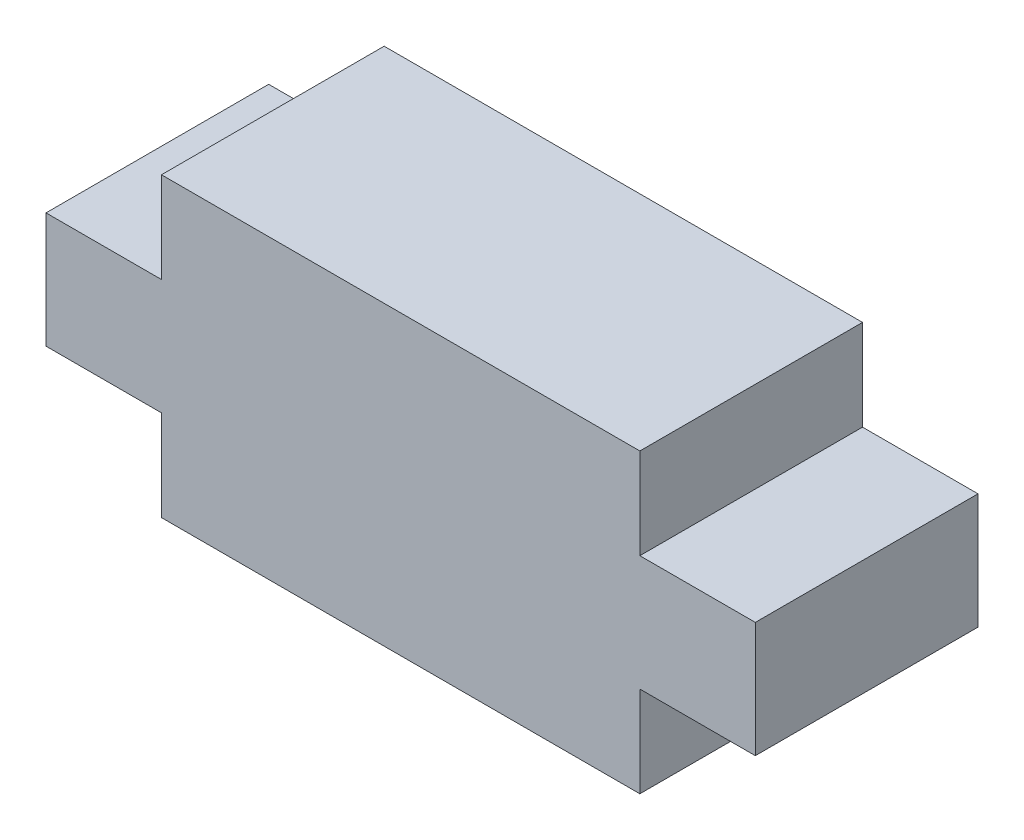
ISO-10303-21;
HEADER;
FILE_DESCRIPTION(('STEP AP214'),'2;1');
FILE_NAME('part.step','',(''),(''),'','','');
FILE_SCHEMA(('AUTOMOTIVE_DESIGN { 1 0 10303 214 1 1 1 1 }'));
ENDSEC;
DATA;
#1=APPLICATION_CONTEXT('core data for automotive mechanical design processes');
#2=APPLICATION_PROTOCOL_DEFINITION('international standard','automotive_design',2000,#1);
#3=PRODUCT_CONTEXT('',#1,'mechanical');
#4=PRODUCT('Part','Part','',(#3));
#5=PRODUCT_RELATED_PRODUCT_CATEGORY('part','',(#4));
#6=PRODUCT_DEFINITION_FORMATION('','',#4);
#7=PRODUCT_DEFINITION_CONTEXT('part definition',#1,'design');
#8=PRODUCT_DEFINITION('design','',#6,#7);
#9=PRODUCT_DEFINITION_SHAPE('','',#8);
#10=(LENGTH_UNIT() NAMED_UNIT(*) SI_UNIT(.MILLI.,.METRE.));
#11=(NAMED_UNIT(*) PLANE_ANGLE_UNIT() SI_UNIT($,.RADIAN.));
#12=(NAMED_UNIT(*) SI_UNIT($,.STERADIAN.) SOLID_ANGLE_UNIT());
#13=UNCERTAINTY_MEASURE_WITH_UNIT(LENGTH_MEASURE(1.E-05),#10,'distance_accuracy_value','');
#14=(GEOMETRIC_REPRESENTATION_CONTEXT(3) GLOBAL_UNCERTAINTY_ASSIGNED_CONTEXT((#13)) GLOBAL_UNIT_ASSIGNED_CONTEXT((#10,
#11,#12)) REPRESENTATION_CONTEXT('',''));
#15=CARTESIAN_POINT('',(0.,0.,0.));
#16=DIRECTION('',(0.,0.,1.));
#17=DIRECTION('',(1.,0.,0.));
#18=AXIS2_PLACEMENT_3D('',#15,#16,#17);
#19=CARTESIAN_POINT('',(2.15,-0.35,1.35));
#20=DIRECTION('',(-1.,0.,0.));
#21=DIRECTION('',(0.,0.,1.));
#22=AXIS2_PLACEMENT_3D('',#19,#20,#21);
#23=PLANE('',#22);
#24=DIRECTION('',(0.,1.,0.));
#25=VECTOR('',#24,1.);
#26=CARTESIAN_POINT('',(2.15,-0.35,0.));
#27=LINE('',#26,#25);
#28=CARTESIAN_POINT('',(2.15,-0.35,0.));
#29=VERTEX_POINT('',#28);
#30=CARTESIAN_POINT('',(2.15,0.35,0.));
#31=VERTEX_POINT('',#30);
#32=EDGE_CURVE('E154',#29,#31,#27,.T.);
#33=ORIENTED_EDGE('',*,*,#32,.T.);
#34=DIRECTION('',(0.,0.,-1.));
#35=VECTOR('',#34,1.);
#36=CARTESIAN_POINT('',(2.15,0.35,1.35));
#37=LINE('',#36,#35);
#38=CARTESIAN_POINT('',(2.15,0.35,1.35));
#39=VERTEX_POINT('',#38);
#40=EDGE_CURVE('E11',#39,#31,#37,.T.);
#41=ORIENTED_EDGE('',*,*,#40,.F.);
#42=DIRECTION('',(0.,1.,0.));
#43=VECTOR('',#42,1.);
#44=CARTESIAN_POINT('',(2.15,-0.35,1.35));
#45=LINE('',#44,#43);
#46=CARTESIAN_POINT('',(2.15,-0.35,1.35));
#47=VERTEX_POINT('',#46);
#48=EDGE_CURVE('E176',#47,#39,#45,.T.);
#49=ORIENTED_EDGE('',*,*,#48,.F.);
#50=DIRECTION('',(0.,0.,-1.));
#51=VECTOR('',#50,1.);
#52=CARTESIAN_POINT('',(2.15,-0.35,1.35));
#53=LINE('',#52,#51);
#54=EDGE_CURVE('E150',#47,#29,#53,.T.);
#55=ORIENTED_EDGE('',*,*,#54,.T.);
#56=EDGE_LOOP('',(#33,#41,#49,#55));
#57=FACE_BOUND('',#56,.T.);
#58=ADVANCED_FACE('F34',(#57),#23,.F.);
#59=CARTESIAN_POINT('',(2.15,0.35,1.35));
#60=DIRECTION('',(0.,-1.,0.));
#61=DIRECTION('',(0.,0.,-1.));
#62=AXIS2_PLACEMENT_3D('',#59,#60,#61);
#63=PLANE('',#62);
#64=DIRECTION('',(-1.,0.,0.));
#65=VECTOR('',#64,1.);
#66=CARTESIAN_POINT('',(2.15,0.35,0.));
#67=LINE('',#66,#65);
#68=CARTESIAN_POINT('',(1.45,0.35,0.));
#69=VERTEX_POINT('',#68);
#70=EDGE_CURVE('E157',#31,#69,#67,.T.);
#71=ORIENTED_EDGE('',*,*,#70,.T.);
#72=DIRECTION('',(0.,0.,-1.));
#73=VECTOR('',#72,1.);
#74=CARTESIAN_POINT('',(1.45,0.35,1.35));
#75=LINE('',#74,#73);
#76=CARTESIAN_POINT('',(1.45,0.35,1.35));
#77=VERTEX_POINT('',#76);
#78=EDGE_CURVE('E42',#77,#69,#75,.T.);
#79=ORIENTED_EDGE('',*,*,#78,.F.);
#80=DIRECTION('',(-1.,0.,0.));
#81=VECTOR('',#80,1.);
#82=CARTESIAN_POINT('',(2.15,0.35,1.35));
#83=LINE('',#82,#81);
#84=EDGE_CURVE('E105',#39,#77,#83,.T.);
#85=ORIENTED_EDGE('',*,*,#84,.F.);
#86=ORIENTED_EDGE('',*,*,#40,.T.);
#87=EDGE_LOOP('',(#71,#79,#85,#86));
#88=FACE_BOUND('',#87,.T.);
#89=ADVANCED_FACE('F254',(#88),#63,.F.);
#90=CARTESIAN_POINT('',(1.45,0.35,1.35));
#91=DIRECTION('',(-1.,0.,0.));
#92=DIRECTION('',(0.,0.,1.));
#93=AXIS2_PLACEMENT_3D('',#90,#91,#92);
#94=PLANE('',#93);
#95=DIRECTION('',(0.,1.,0.));
#96=VECTOR('',#95,1.);
#97=CARTESIAN_POINT('',(1.45,0.35,0.));
#98=LINE('',#97,#96);
#99=CARTESIAN_POINT('',(1.45,0.9,0.));
#100=VERTEX_POINT('',#99);
#101=EDGE_CURVE('E159',#69,#100,#98,.T.);
#102=ORIENTED_EDGE('',*,*,#101,.T.);
#103=DIRECTION('',(0.,0.,-1.));
#104=VECTOR('',#103,1.);
#105=CARTESIAN_POINT('',(1.45,0.9,1.35));
#106=LINE('',#105,#104);
#107=CARTESIAN_POINT('',(1.45,0.9,1.35));
#108=VERTEX_POINT('',#107);
#109=EDGE_CURVE('E195',#108,#100,#106,.T.);
#110=ORIENTED_EDGE('',*,*,#109,.F.);
#111=DIRECTION('',(0.,1.,0.));
#112=VECTOR('',#111,1.);
#113=CARTESIAN_POINT('',(1.45,0.35,1.35));
#114=LINE('',#113,#112);
#115=EDGE_CURVE('E203',#77,#108,#114,.T.);
#116=ORIENTED_EDGE('',*,*,#115,.F.);
#117=ORIENTED_EDGE('',*,*,#78,.T.);
#118=EDGE_LOOP('',(#102,#110,#116,#117));
#119=FACE_BOUND('',#118,.T.);
#120=ADVANCED_FACE('F201',(#119),#94,.F.);
#121=CARTESIAN_POINT('',(1.45,0.9,1.35));
#122=DIRECTION('',(0.,-1.,0.));
#123=DIRECTION('',(0.,0.,-1.));
#124=AXIS2_PLACEMENT_3D('',#121,#122,#123);
#125=PLANE('',#124);
#126=DIRECTION('',(-1.,0.,0.));
#127=VECTOR('',#126,1.);
#128=CARTESIAN_POINT('',(1.45,0.9,0.));
#129=LINE('',#128,#127);
#130=CARTESIAN_POINT('',(-1.45,0.9,0.));
#131=VERTEX_POINT('',#130);
#132=EDGE_CURVE('E161',#100,#131,#129,.T.);
#133=ORIENTED_EDGE('',*,*,#132,.T.);
#134=DIRECTION('',(0.,0.,-1.));
#135=VECTOR('',#134,1.);
#136=CARTESIAN_POINT('',(-1.45,0.9,1.35));
#137=LINE('',#136,#135);
#138=CARTESIAN_POINT('',(-1.45,0.9,1.35));
#139=VERTEX_POINT('',#138);
#140=EDGE_CURVE('E192',#139,#131,#137,.T.);
#141=ORIENTED_EDGE('',*,*,#140,.F.);
#142=DIRECTION('',(-1.,0.,0.));
#143=VECTOR('',#142,1.);
#144=CARTESIAN_POINT('',(1.45,0.9,1.35));
#145=LINE('',#144,#143);
#146=EDGE_CURVE('E221',#108,#139,#145,.T.);
#147=ORIENTED_EDGE('',*,*,#146,.F.);
#148=ORIENTED_EDGE('',*,*,#109,.T.);
#149=EDGE_LOOP('',(#133,#141,#147,#148));
#150=FACE_BOUND('',#149,.T.);
#151=ADVANCED_FACE('F212',(#150),#125,.F.);
#152=CARTESIAN_POINT('',(-1.45,0.9,1.35));
#153=DIRECTION('',(1.,0.,0.));
#154=DIRECTION('',(0.,0.,-1.));
#155=AXIS2_PLACEMENT_3D('',#152,#153,#154);
#156=PLANE('',#155);
#157=DIRECTION('',(0.,-1.,0.));
#158=VECTOR('',#157,1.);
#159=CARTESIAN_POINT('',(-1.45,0.9,0.));
#160=LINE('',#159,#158);
#161=CARTESIAN_POINT('',(-1.45,0.35,0.));
#162=VERTEX_POINT('',#161);
#163=EDGE_CURVE('E163',#131,#162,#160,.T.);
#164=ORIENTED_EDGE('',*,*,#163,.T.);
#165=DIRECTION('',(0.,0.,-1.));
#166=VECTOR('',#165,1.);
#167=CARTESIAN_POINT('',(-1.45,0.35,1.35));
#168=LINE('',#167,#166);
#169=CARTESIAN_POINT('',(-1.45,0.35,1.35));
#170=VERTEX_POINT('',#169);
#171=EDGE_CURVE('E189',#170,#162,#168,.T.);
#172=ORIENTED_EDGE('',*,*,#171,.F.);
#173=DIRECTION('',(0.,-1.,0.));
#174=VECTOR('',#173,1.);
#175=CARTESIAN_POINT('',(-1.45,0.9,1.35));
#176=LINE('',#175,#174);
#177=EDGE_CURVE('E218',#139,#170,#176,.T.);
#178=ORIENTED_EDGE('',*,*,#177,.F.);
#179=ORIENTED_EDGE('',*,*,#140,.T.);
#180=EDGE_LOOP('',(#164,#172,#178,#179));
#181=FACE_BOUND('',#180,.T.);
#182=ADVANCED_FACE('F216',(#181),#156,.F.);
#183=CARTESIAN_POINT('',(-1.45,0.35,1.35));
#184=DIRECTION('',(0.,-1.,0.));
#185=DIRECTION('',(0.,0.,-1.));
#186=AXIS2_PLACEMENT_3D('',#183,#184,#185);
#187=PLANE('',#186);
#188=DIRECTION('',(-1.,0.,0.));
#189=VECTOR('',#188,1.);
#190=CARTESIAN_POINT('',(-1.45,0.35,0.));
#191=LINE('',#190,#189);
#192=CARTESIAN_POINT('',(-2.15,0.35,0.));
#193=VERTEX_POINT('',#192);
#194=EDGE_CURVE('E165',#162,#193,#191,.T.);
#195=ORIENTED_EDGE('',*,*,#194,.T.);
#196=DIRECTION('',(0.,0.,-1.));
#197=VECTOR('',#196,1.);
#198=CARTESIAN_POINT('',(-2.15,0.35,1.35));
#199=LINE('',#198,#197);
#200=CARTESIAN_POINT('',(-2.15,0.35,1.35));
#201=VERTEX_POINT('',#200);
#202=EDGE_CURVE('E186',#201,#193,#199,.T.);
#203=ORIENTED_EDGE('',*,*,#202,.F.);
#204=DIRECTION('',(-1.,0.,0.));
#205=VECTOR('',#204,1.);
#206=CARTESIAN_POINT('',(-1.45,0.35,1.35));
#207=LINE('',#206,#205);
#208=EDGE_CURVE('E220',#170,#201,#207,.T.);
#209=ORIENTED_EDGE('',*,*,#208,.F.);
#210=ORIENTED_EDGE('',*,*,#171,.T.);
#211=EDGE_LOOP('',(#195,#203,#209,#210));
#212=FACE_BOUND('',#211,.T.);
#213=ADVANCED_FACE('F267',(#212),#187,.F.);
#214=CARTESIAN_POINT('',(-2.15,0.35,1.35));
#215=DIRECTION('',(1.,0.,0.));
#216=DIRECTION('',(0.,0.,-1.));
#217=AXIS2_PLACEMENT_3D('',#214,#215,#216);
#218=PLANE('',#217);
#219=DIRECTION('',(0.,-1.,0.));
#220=VECTOR('',#219,1.);
#221=CARTESIAN_POINT('',(-2.15,0.35,0.));
#222=LINE('',#221,#220);
#223=CARTESIAN_POINT('',(-2.15,-0.35,0.));
#224=VERTEX_POINT('',#223);
#225=EDGE_CURVE('E167',#193,#224,#222,.T.);
#226=ORIENTED_EDGE('',*,*,#225,.T.);
#227=DIRECTION('',(0.,0.,-1.));
#228=VECTOR('',#227,1.);
#229=CARTESIAN_POINT('',(-2.15,-0.35,1.35));
#230=LINE('',#229,#228);
#231=CARTESIAN_POINT('',(-2.15,-0.35,1.35));
#232=VERTEX_POINT('',#231);
#233=EDGE_CURVE('E183',#232,#224,#230,.T.);
#234=ORIENTED_EDGE('',*,*,#233,.F.);
#235=DIRECTION('',(0.,-1.,0.));
#236=VECTOR('',#235,1.);
#237=CARTESIAN_POINT('',(-2.15,0.35,1.35));
#238=LINE('',#237,#236);
#239=EDGE_CURVE('E223',#201,#232,#238,.T.);
#240=ORIENTED_EDGE('',*,*,#239,.F.);
#241=ORIENTED_EDGE('',*,*,#202,.T.);
#242=EDGE_LOOP('',(#226,#234,#240,#241));
#243=FACE_BOUND('',#242,.T.);
#244=ADVANCED_FACE('F270',(#243),#218,.F.);
#245=CARTESIAN_POINT('',(-2.15,-0.35,1.35));
#246=DIRECTION('',(0.,1.,0.));
#247=DIRECTION('',(0.,0.,1.));
#248=AXIS2_PLACEMENT_3D('',#245,#246,#247);
#249=PLANE('',#248);
#250=DIRECTION('',(1.,0.,0.));
#251=VECTOR('',#250,1.);
#252=CARTESIAN_POINT('',(-2.15,-0.35,0.));
#253=LINE('',#252,#251);
#254=CARTESIAN_POINT('',(-1.45,-0.35,0.));
#255=VERTEX_POINT('',#254);
#256=EDGE_CURVE('E169',#224,#255,#253,.T.);
#257=ORIENTED_EDGE('',*,*,#256,.T.);
#258=DIRECTION('',(0.,0.,-1.));
#259=VECTOR('',#258,1.);
#260=CARTESIAN_POINT('',(-1.45,-0.35,1.35));
#261=LINE('',#260,#259);
#262=CARTESIAN_POINT('',(-1.45,-0.35,1.35));
#263=VERTEX_POINT('',#262);
#264=EDGE_CURVE('E180',#263,#255,#261,.T.);
#265=ORIENTED_EDGE('',*,*,#264,.F.);
#266=DIRECTION('',(1.,0.,0.));
#267=VECTOR('',#266,1.);
#268=CARTESIAN_POINT('',(-2.15,-0.35,1.35));
#269=LINE('',#268,#267);
#270=EDGE_CURVE('E229',#232,#263,#269,.T.);
#271=ORIENTED_EDGE('',*,*,#270,.F.);
#272=ORIENTED_EDGE('',*,*,#233,.T.);
#273=EDGE_LOOP('',(#257,#265,#271,#272));
#274=FACE_BOUND('',#273,.T.);
#275=ADVANCED_FACE('F235',(#274),#249,.F.);
#276=CARTESIAN_POINT('',(-1.45,-0.35,1.35));
#277=DIRECTION('',(1.,0.,0.));
#278=DIRECTION('',(0.,0.,-1.));
#279=AXIS2_PLACEMENT_3D('',#276,#277,#278);
#280=PLANE('',#279);
#281=DIRECTION('',(0.,-1.,0.));
#282=VECTOR('',#281,1.);
#283=CARTESIAN_POINT('',(-1.45,-0.35,0.));
#284=LINE('',#283,#282);
#285=CARTESIAN_POINT('',(-1.45,-0.9,0.));
#286=VERTEX_POINT('',#285);
#287=EDGE_CURVE('E171',#255,#286,#284,.T.);
#288=ORIENTED_EDGE('',*,*,#287,.T.);
#289=DIRECTION('',(0.,0.,-1.));
#290=VECTOR('',#289,1.);
#291=CARTESIAN_POINT('',(-1.45,-0.9,1.35));
#292=LINE('',#291,#290);
#293=CARTESIAN_POINT('',(-1.45,-0.9,1.35));
#294=VERTEX_POINT('',#293);
#295=EDGE_CURVE('E145',#294,#286,#292,.T.);
#296=ORIENTED_EDGE('',*,*,#295,.F.);
#297=DIRECTION('',(0.,-1.,0.));
#298=VECTOR('',#297,1.);
#299=CARTESIAN_POINT('',(-1.45,-0.35,1.35));
#300=LINE('',#299,#298);
#301=EDGE_CURVE('E136',#263,#294,#300,.T.);
#302=ORIENTED_EDGE('',*,*,#301,.F.);
#303=ORIENTED_EDGE('',*,*,#264,.T.);
#304=EDGE_LOOP('',(#288,#296,#302,#303));
#305=FACE_BOUND('',#304,.T.);
#306=ADVANCED_FACE('F239',(#305),#280,.F.);
#307=CARTESIAN_POINT('',(-1.45,-0.9,1.35));
#308=DIRECTION('',(0.,1.,0.));
#309=DIRECTION('',(0.,0.,1.));
#310=AXIS2_PLACEMENT_3D('',#307,#308,#309);
#311=PLANE('',#310);
#312=DIRECTION('',(1.,0.,0.));
#313=VECTOR('',#312,1.);
#314=CARTESIAN_POINT('',(-1.45,-0.9,0.));
#315=LINE('',#314,#313);
#316=CARTESIAN_POINT('',(1.45,-0.9,0.));
#317=VERTEX_POINT('',#316);
#318=EDGE_CURVE('E144',#286,#317,#315,.T.);
#319=ORIENTED_EDGE('',*,*,#318,.T.);
#320=DIRECTION('',(0.,0.,-1.));
#321=VECTOR('',#320,1.);
#322=CARTESIAN_POINT('',(1.45,-0.9,1.35));
#323=LINE('',#322,#321);
#324=CARTESIAN_POINT('',(1.45,-0.9,1.35));
#325=VERTEX_POINT('',#324);
#326=EDGE_CURVE('E141',#325,#317,#323,.T.);
#327=ORIENTED_EDGE('',*,*,#326,.F.);
#328=DIRECTION('',(1.,0.,0.));
#329=VECTOR('',#328,1.);
#330=CARTESIAN_POINT('',(-1.45,-0.9,1.35));
#331=LINE('',#330,#329);
#332=EDGE_CURVE('E130',#294,#325,#331,.T.);
#333=ORIENTED_EDGE('',*,*,#332,.F.);
#334=ORIENTED_EDGE('',*,*,#295,.T.);
#335=EDGE_LOOP('',(#319,#327,#333,#334));
#336=FACE_BOUND('',#335,.T.);
#337=ADVANCED_FACE('F142',(#336),#311,.F.);
#338=CARTESIAN_POINT('',(1.45,-0.9,1.35));
#339=DIRECTION('',(-1.,0.,0.));
#340=DIRECTION('',(0.,0.,1.));
#341=AXIS2_PLACEMENT_3D('',#338,#339,#340);
#342=PLANE('',#341);
#343=DIRECTION('',(0.,1.,0.));
#344=VECTOR('',#343,1.);
#345=CARTESIAN_POINT('',(1.45,-0.9,0.));
#346=LINE('',#345,#344);
#347=CARTESIAN_POINT('',(1.45,-0.35,0.));
#348=VERTEX_POINT('',#347);
#349=EDGE_CURVE('E91',#317,#348,#346,.T.);
#350=ORIENTED_EDGE('',*,*,#349,.T.);
#351=DIRECTION('',(0.,0.,-1.));
#352=VECTOR('',#351,1.);
#353=CARTESIAN_POINT('',(1.45,-0.35,1.35));
#354=LINE('',#353,#352);
#355=CARTESIAN_POINT('',(1.45,-0.35,1.35));
#356=VERTEX_POINT('',#355);
#357=EDGE_CURVE('E146',#356,#348,#354,.T.);
#358=ORIENTED_EDGE('',*,*,#357,.F.);
#359=DIRECTION('',(0.,1.,0.));
#360=VECTOR('',#359,1.);
#361=CARTESIAN_POINT('',(1.45,-0.9,1.35));
#362=LINE('',#361,#360);
#363=EDGE_CURVE('E134',#325,#356,#362,.T.);
#364=ORIENTED_EDGE('',*,*,#363,.F.);
#365=ORIENTED_EDGE('',*,*,#326,.T.);
#366=EDGE_LOOP('',(#350,#358,#364,#365));
#367=FACE_BOUND('',#366,.T.);
#368=ADVANCED_FACE('F148',(#367),#342,.F.);
#369=CARTESIAN_POINT('',(1.45,-0.35,1.35));
#370=DIRECTION('',(0.,1.,0.));
#371=DIRECTION('',(0.,0.,1.));
#372=AXIS2_PLACEMENT_3D('',#369,#370,#371);
#373=PLANE('',#372);
#374=DIRECTION('',(1.,0.,0.));
#375=VECTOR('',#374,1.);
#376=CARTESIAN_POINT('',(1.45,-0.35,0.));
#377=LINE('',#376,#375);
#378=EDGE_CURVE('E97',#348,#29,#377,.T.);
#379=ORIENTED_EDGE('',*,*,#378,.T.);
#380=ORIENTED_EDGE('',*,*,#54,.F.);
#381=DIRECTION('',(1.,0.,0.));
#382=VECTOR('',#381,1.);
#383=CARTESIAN_POINT('',(1.45,-0.35,1.35));
#384=LINE('',#383,#382);
#385=EDGE_CURVE('E50',#356,#47,#384,.T.);
#386=ORIENTED_EDGE('',*,*,#385,.F.);
#387=ORIENTED_EDGE('',*,*,#357,.T.);
#388=EDGE_LOOP('',(#379,#380,#386,#387));
#389=FACE_BOUND('',#388,.T.);
#390=ADVANCED_FACE('F243',(#389),#373,.F.);
#391=CARTESIAN_POINT('',(0.,0.,1.35));
#392=DIRECTION('',(0.,0.,1.));
#393=DIRECTION('',(1.,0.,0.));
#394=AXIS2_PLACEMENT_3D('',#391,#392,#393);
#395=PLANE('',#394);
#396=ORIENTED_EDGE('',*,*,#48,.T.);
#397=ORIENTED_EDGE('',*,*,#84,.T.);
#398=ORIENTED_EDGE('',*,*,#115,.T.);
#399=ORIENTED_EDGE('',*,*,#146,.T.);
#400=ORIENTED_EDGE('',*,*,#177,.T.);
#401=ORIENTED_EDGE('',*,*,#208,.T.);
#402=ORIENTED_EDGE('',*,*,#239,.T.);
#403=ORIENTED_EDGE('',*,*,#270,.T.);
#404=ORIENTED_EDGE('',*,*,#301,.T.);
#405=ORIENTED_EDGE('',*,*,#332,.T.);
#406=ORIENTED_EDGE('',*,*,#363,.T.);
#407=ORIENTED_EDGE('',*,*,#385,.T.);
#408=EDGE_LOOP('',(#396,#397,#398,#399,#400,#401,#402,#403,#404,#405,#406,#407));
#409=FACE_BOUND('',#408,.T.);
#410=ADVANCED_FACE('F132',(#409),#395,.T.);
#411=CARTESIAN_POINT('',(0.,0.,0.));
#412=DIRECTION('',(0.,0.,1.));
#413=DIRECTION('',(1.,0.,0.));
#414=AXIS2_PLACEMENT_3D('',#411,#412,#413);
#415=PLANE('',#414);
#416=ORIENTED_EDGE('',*,*,#32,.F.);
#417=ORIENTED_EDGE('',*,*,#378,.F.);
#418=ORIENTED_EDGE('',*,*,#349,.F.);
#419=ORIENTED_EDGE('',*,*,#318,.F.);
#420=ORIENTED_EDGE('',*,*,#287,.F.);
#421=ORIENTED_EDGE('',*,*,#256,.F.);
#422=ORIENTED_EDGE('',*,*,#225,.F.);
#423=ORIENTED_EDGE('',*,*,#194,.F.);
#424=ORIENTED_EDGE('',*,*,#163,.F.);
#425=ORIENTED_EDGE('',*,*,#132,.F.);
#426=ORIENTED_EDGE('',*,*,#101,.F.);
#427=ORIENTED_EDGE('',*,*,#70,.F.);
#428=EDGE_LOOP('',(#416,#417,#418,#419,#420,#421,#422,#423,#424,#425,#426,#427));
#429=FACE_BOUND('',#428,.T.);
#430=ADVANCED_FACE('F207',(#429),#415,.F.);
#431=CLOSED_SHELL('',(#58,#89,#120,#151,#182,#213,#244,#275,#306,#337,#368,#390,#410,#430));
#432=MANIFOLD_SOLID_BREP('B2',#431);
#433=ADVANCED_BREP_SHAPE_REPRESENTATION('',(#18,#432),#14);
#434=SHAPE_DEFINITION_REPRESENTATION(#9,#433);
ENDSEC;
END-ISO-10303-21;
